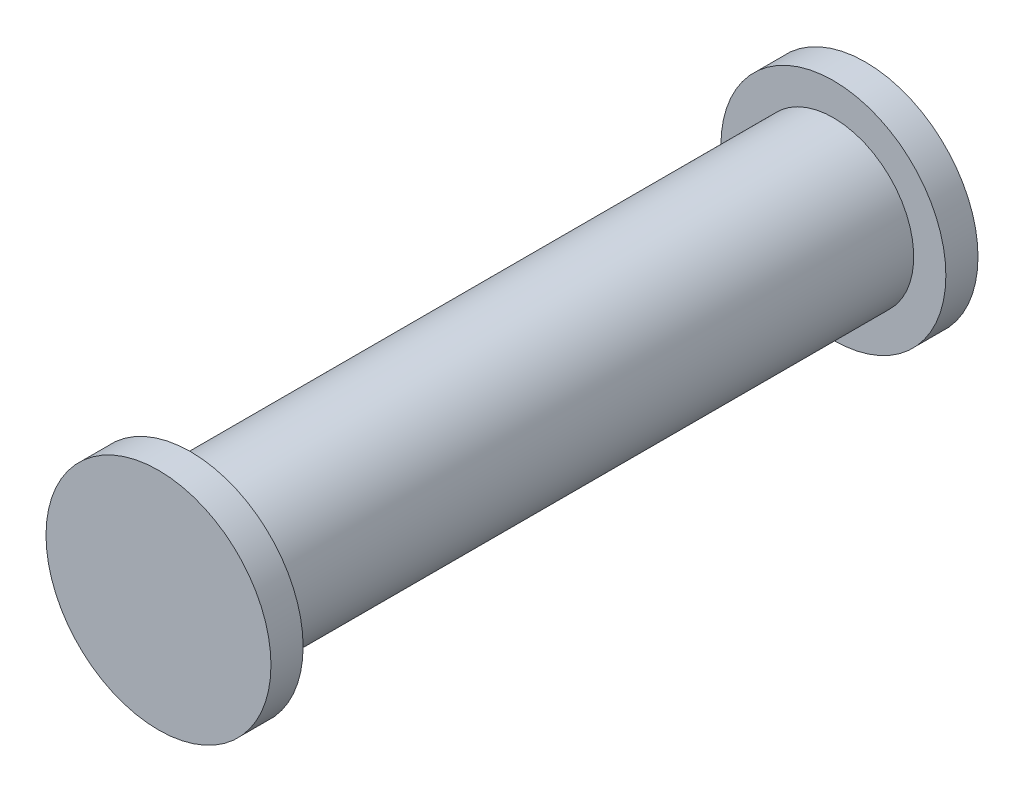
ISO-10303-21;
HEADER;
FILE_DESCRIPTION(('STEP AP214'),'2;1');
FILE_NAME('part.step','',(''),(''),'','','');
FILE_SCHEMA(('AUTOMOTIVE_DESIGN { 1 0 10303 214 1 1 1 1 }'));
ENDSEC;
DATA;
#1=APPLICATION_CONTEXT('core data for automotive mechanical design processes');
#2=APPLICATION_PROTOCOL_DEFINITION('international standard','automotive_design',2000,#1);
#3=PRODUCT_CONTEXT('',#1,'mechanical');
#4=PRODUCT('Part','Part','',(#3));
#5=PRODUCT_RELATED_PRODUCT_CATEGORY('part','',(#4));
#6=PRODUCT_DEFINITION_FORMATION('','',#4);
#7=PRODUCT_DEFINITION_CONTEXT('part definition',#1,'design');
#8=PRODUCT_DEFINITION('design','',#6,#7);
#9=PRODUCT_DEFINITION_SHAPE('','',#8);
#10=(LENGTH_UNIT() NAMED_UNIT(*) SI_UNIT(.MILLI.,.METRE.));
#11=(NAMED_UNIT(*) PLANE_ANGLE_UNIT() SI_UNIT($,.RADIAN.));
#12=(NAMED_UNIT(*) SI_UNIT($,.STERADIAN.) SOLID_ANGLE_UNIT());
#13=UNCERTAINTY_MEASURE_WITH_UNIT(LENGTH_MEASURE(1.E-05),#10,'distance_accuracy_value','');
#14=(GEOMETRIC_REPRESENTATION_CONTEXT(3) GLOBAL_UNCERTAINTY_ASSIGNED_CONTEXT((#13)) GLOBAL_UNIT_ASSIGNED_CONTEXT((#10,
#11,#12)) REPRESENTATION_CONTEXT('',''));
#15=CARTESIAN_POINT('',(0.,0.,0.));
#16=DIRECTION('',(0.,0.,1.));
#17=DIRECTION('',(1.,0.,0.));
#18=AXIS2_PLACEMENT_3D('',#15,#16,#17);
#19=CARTESIAN_POINT('',(0.,0.,100.));
#20=DIRECTION('',(0.,0.,-1.));
#21=DIRECTION('',(-1.,0.,0.));
#22=AXIS2_PLACEMENT_3D('',#19,#20,#21);
#23=CYLINDRICAL_SURFACE('',#22,12.5);
#24=CARTESIAN_POINT('',(0.,0.,100.));
#25=DIRECTION('',(0.,0.,1.));
#26=DIRECTION('',(1.,0.,0.));
#27=AXIS2_PLACEMENT_3D('',#24,#25,#26);
#28=CIRCLE('',#27,12.5);
#29=CARTESIAN_POINT('',(12.5,0.,100.));
#30=VERTEX_POINT('',#29);
#31=EDGE_CURVE('E10',#30,#30,#28,.T.);
#32=ORIENTED_EDGE('',*,*,#31,.F.);
#33=EDGE_LOOP('',(#32));
#34=FACE_BOUND('',#33,.T.);
#35=CARTESIAN_POINT('',(0.,0.,0.));
#36=DIRECTION('',(0.,0.,-1.));
#37=DIRECTION('',(-1.,0.,0.));
#38=AXIS2_PLACEMENT_3D('',#35,#36,#37);
#39=CIRCLE('',#38,12.5);
#40=CARTESIAN_POINT('',(-12.5,0.,0.));
#41=VERTEX_POINT('',#40);
#42=EDGE_CURVE('E46',#41,#41,#39,.T.);
#43=ORIENTED_EDGE('',*,*,#42,.F.);
#44=EDGE_LOOP('',(#43));
#45=FACE_BOUND('',#44,.T.);
#46=ADVANCED_FACE('F31',(#34,#45),#23,.T.);
#47=CARTESIAN_POINT('',(0.,0.,100.));
#48=DIRECTION('',(0.,0.,1.));
#49=DIRECTION('',(1.,0.,0.));
#50=AXIS2_PLACEMENT_3D('',#47,#48,#49);
#51=PLANE('',#50);
#52=CARTESIAN_POINT('',(0.,0.,100.));
#53=DIRECTION('',(0.,0.,1.));
#54=DIRECTION('',(1.,0.,0.));
#55=AXIS2_PLACEMENT_3D('',#52,#53,#54);
#56=CIRCLE('',#55,17.5);
#57=CARTESIAN_POINT('',(17.5,0.,100.));
#58=VERTEX_POINT('',#57);
#59=EDGE_CURVE('E41',#58,#58,#56,.T.);
#60=ORIENTED_EDGE('',*,*,#59,.F.);
#61=EDGE_LOOP('',(#60));
#62=FACE_BOUND('',#61,.T.);
#63=ORIENTED_EDGE('',*,*,#31,.T.);
#64=EDGE_LOOP('',(#63));
#65=FACE_BOUND('',#64,.T.);
#66=ADVANCED_FACE('F73',(#62,#65),#51,.F.);
#67=CARTESIAN_POINT('',(0.,0.,105.));
#68=DIRECTION('',(0.,0.,-1.));
#69=DIRECTION('',(-1.,0.,0.));
#70=AXIS2_PLACEMENT_3D('',#67,#68,#69);
#71=CYLINDRICAL_SURFACE('',#70,17.5);
#72=CARTESIAN_POINT('',(0.,0.,105.));
#73=DIRECTION('',(0.,0.,1.));
#74=DIRECTION('',(1.,0.,0.));
#75=AXIS2_PLACEMENT_3D('',#72,#73,#74);
#76=CIRCLE('',#75,17.5);
#77=CARTESIAN_POINT('',(17.5,0.,105.));
#78=VERTEX_POINT('',#77);
#79=EDGE_CURVE('E37',#78,#78,#76,.T.);
#80=ORIENTED_EDGE('',*,*,#79,.F.);
#81=EDGE_LOOP('',(#80));
#82=FACE_BOUND('',#81,.T.);
#83=ORIENTED_EDGE('',*,*,#59,.T.);
#84=EDGE_LOOP('',(#83));
#85=FACE_BOUND('',#84,.T.);
#86=ADVANCED_FACE('F78',(#82,#85),#71,.T.);
#87=CARTESIAN_POINT('',(0.,0.,105.));
#88=DIRECTION('',(0.,0.,1.));
#89=DIRECTION('',(1.,0.,0.));
#90=AXIS2_PLACEMENT_3D('',#87,#88,#89);
#91=PLANE('',#90);
#92=ORIENTED_EDGE('',*,*,#79,.T.);
#93=EDGE_LOOP('',(#92));
#94=FACE_BOUND('',#93,.T.);
#95=ADVANCED_FACE('F68',(#94),#91,.T.);
#96=CARTESIAN_POINT('',(0.,0.,0.));
#97=DIRECTION('',(0.,0.,-1.));
#98=DIRECTION('',(-1.,0.,0.));
#99=AXIS2_PLACEMENT_3D('',#96,#97,#98);
#100=PLANE('',#99);
#101=CARTESIAN_POINT('',(0.,0.,0.));
#102=DIRECTION('',(0.,0.,-1.));
#103=DIRECTION('',(-1.,0.,0.));
#104=AXIS2_PLACEMENT_3D('',#101,#102,#103);
#105=CIRCLE('',#104,17.5);
#106=CARTESIAN_POINT('',(-17.5,0.,0.));
#107=VERTEX_POINT('',#106);
#108=EDGE_CURVE('E51',#107,#107,#105,.T.);
#109=ORIENTED_EDGE('',*,*,#108,.F.);
#110=EDGE_LOOP('',(#109));
#111=FACE_BOUND('',#110,.T.);
#112=ORIENTED_EDGE('',*,*,#42,.T.);
#113=EDGE_LOOP('',(#112));
#114=FACE_BOUND('',#113,.T.);
#115=ADVANCED_FACE('F62',(#111,#114),#100,.F.);
#116=CARTESIAN_POINT('',(0.,0.,-5.));
#117=DIRECTION('',(0.,0.,1.));
#118=DIRECTION('',(1.,0.,0.));
#119=AXIS2_PLACEMENT_3D('',#116,#117,#118);
#120=CYLINDRICAL_SURFACE('',#119,17.5);
#121=CARTESIAN_POINT('',(0.,0.,-5.));
#122=DIRECTION('',(0.,0.,-1.));
#123=DIRECTION('',(-1.,0.,0.));
#124=AXIS2_PLACEMENT_3D('',#121,#122,#123);
#125=CIRCLE('',#124,17.5);
#126=CARTESIAN_POINT('',(-17.5,0.,-5.));
#127=VERTEX_POINT('',#126);
#128=EDGE_CURVE('E50',#127,#127,#125,.T.);
#129=ORIENTED_EDGE('',*,*,#128,.F.);
#130=EDGE_LOOP('',(#129));
#131=FACE_BOUND('',#130,.T.);
#132=ORIENTED_EDGE('',*,*,#108,.T.);
#133=EDGE_LOOP('',(#132));
#134=FACE_BOUND('',#133,.T.);
#135=ADVANCED_FACE('F59',(#131,#134),#120,.T.);
#136=CARTESIAN_POINT('',(0.,0.,-5.));
#137=DIRECTION('',(0.,0.,-1.));
#138=DIRECTION('',(-1.,0.,0.));
#139=AXIS2_PLACEMENT_3D('',#136,#137,#138);
#140=PLANE('',#139);
#141=ORIENTED_EDGE('',*,*,#128,.T.);
#142=EDGE_LOOP('',(#141));
#143=FACE_BOUND('',#142,.T.);
#144=ADVANCED_FACE('F57',(#143),#140,.T.);
#145=CLOSED_SHELL('',(#46,#66,#86,#95,#115,#135,#144));
#146=MANIFOLD_SOLID_BREP('B2',#145);
#147=ADVANCED_BREP_SHAPE_REPRESENTATION('',(#18,#146),#14);
#148=SHAPE_DEFINITION_REPRESENTATION(#9,#147);
ENDSEC;
END-ISO-10303-21;
